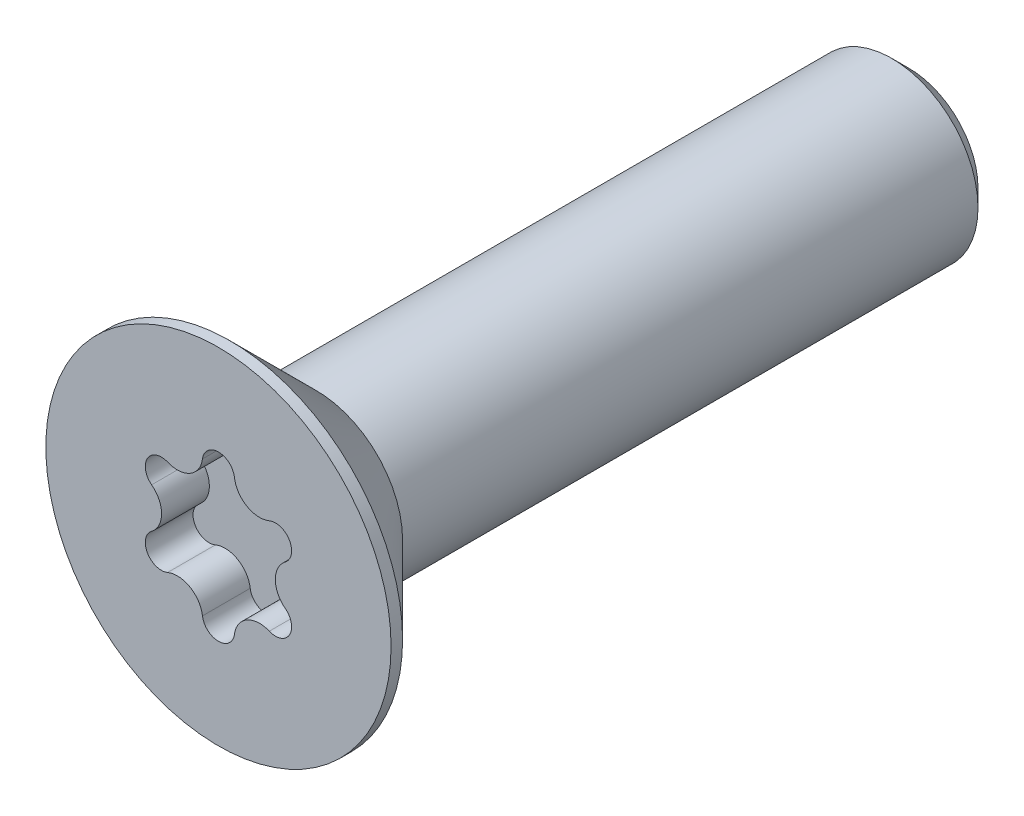
ISO-10303-21;
HEADER;
FILE_DESCRIPTION(('STEP AP214'),'2;1');
FILE_NAME('part.step','',(''),(''),'','','');
FILE_SCHEMA(('AUTOMOTIVE_DESIGN { 1 0 10303 214 1 1 1 1 }'));
ENDSEC;
DATA;
#1=APPLICATION_CONTEXT('core data for automotive mechanical design processes');
#2=APPLICATION_PROTOCOL_DEFINITION('international standard','automotive_design',2000,#1);
#3=PRODUCT_CONTEXT('',#1,'mechanical');
#4=PRODUCT('Part','Part','',(#3));
#5=PRODUCT_RELATED_PRODUCT_CATEGORY('part','',(#4));
#6=PRODUCT_DEFINITION_FORMATION('','',#4);
#7=PRODUCT_DEFINITION_CONTEXT('part definition',#1,'design');
#8=PRODUCT_DEFINITION('design','',#6,#7);
#9=PRODUCT_DEFINITION_SHAPE('','',#8);
#10=(LENGTH_UNIT() NAMED_UNIT(*) SI_UNIT(.MILLI.,.METRE.));
#11=(NAMED_UNIT(*) PLANE_ANGLE_UNIT() SI_UNIT($,.RADIAN.));
#12=(NAMED_UNIT(*) SI_UNIT($,.STERADIAN.) SOLID_ANGLE_UNIT());
#13=UNCERTAINTY_MEASURE_WITH_UNIT(LENGTH_MEASURE(1.E-05),#10,'distance_accuracy_value','');
#14=(GEOMETRIC_REPRESENTATION_CONTEXT(3) GLOBAL_UNCERTAINTY_ASSIGNED_CONTEXT((#13)) GLOBAL_UNIT_ASSIGNED_CONTEXT((#10,
#11,#12)) REPRESENTATION_CONTEXT('',''));
#15=CARTESIAN_POINT('',(0.,0.,0.));
#16=DIRECTION('',(0.,0.,1.));
#17=DIRECTION('',(1.,0.,0.));
#18=AXIS2_PLACEMENT_3D('',#15,#16,#17);
#19=CARTESIAN_POINT('',(0.,0.,-10.3));
#20=DIRECTION('',(0.,0.,1.));
#21=DIRECTION('',(1.,0.,0.));
#22=AXIS2_PLACEMENT_3D('',#19,#20,#21);
#23=PLANE('',#22);
#24=CARTESIAN_POINT('',(0.,0.,-10.3));
#25=DIRECTION('',(0.,0.,1.));
#26=DIRECTION('',(1.,0.,0.));
#27=AXIS2_PLACEMENT_3D('',#24,#25,#26);
#28=CIRCLE('',#27,1.2);
#29=CARTESIAN_POINT('',(1.2,0.,-10.3));
#30=VERTEX_POINT('',#29);
#31=EDGE_CURVE('E25',#30,#30,#28,.T.);
#32=ORIENTED_EDGE('',*,*,#31,.F.);
#33=EDGE_LOOP('',(#32));
#34=FACE_BOUND('',#33,.T.);
#35=ADVANCED_FACE('F15',(#34),#23,.F.);
#36=CARTESIAN_POINT('',(0.,0.,-10.3));
#37=DIRECTION('',(0.,0.,1.));
#38=DIRECTION('',(1.,0.,0.));
#39=AXIS2_PLACEMENT_3D('',#36,#37,#38);
#40=CONICAL_SURFACE('',#39,1.2,0.785398163397);
#41=ORIENTED_EDGE('',*,*,#31,.T.);
#42=DIRECTION('',(0.707106781186548,0.,0.707106781186548));
#43=VECTOR('',#42,1.);
#44=CARTESIAN_POINT('',(1.2,0.,-10.3));
#45=LINE('',#44,#43);
#46=CARTESIAN_POINT('',(1.5,0.,-10.));
#47=VERTEX_POINT('',#46);
#48=EDGE_CURVE('E10',#30,#47,#45,.T.);
#49=ORIENTED_EDGE('',*,*,#48,.T.);
#50=CARTESIAN_POINT('',(0.,0.,-10.));
#51=DIRECTION('',(0.,0.,1.));
#52=DIRECTION('',(1.,0.,0.));
#53=AXIS2_PLACEMENT_3D('',#50,#51,#52);
#54=CIRCLE('',#53,1.5);
#55=EDGE_CURVE('E238',#47,#47,#54,.T.);
#56=ORIENTED_EDGE('',*,*,#55,.F.);
#57=ORIENTED_EDGE('',*,*,#48,.F.);
#58=EDGE_LOOP('',(#41,#49,#56,#57));
#59=FACE_BOUND('',#58,.T.);
#60=ADVANCED_FACE('F298',(#59),#40,.T.);
#61=CARTESIAN_POINT('',(0.,0.,-10.));
#62=DIRECTION('',(0.,0.,1.));
#63=DIRECTION('',(1.,0.,0.));
#64=AXIS2_PLACEMENT_3D('',#61,#62,#63);
#65=CYLINDRICAL_SURFACE('',#64,1.5);
#66=ORIENTED_EDGE('',*,*,#55,.T.);
#67=DIRECTION('',(0.,0.,1.));
#68=VECTOR('',#67,1.);
#69=CARTESIAN_POINT('',(1.5,0.,-10.));
#70=LINE('',#69,#68);
#71=CARTESIAN_POINT('',(1.5,0.,0.));
#72=VERTEX_POINT('',#71);
#73=EDGE_CURVE('E165',#47,#72,#70,.T.);
#74=ORIENTED_EDGE('',*,*,#73,.T.);
#75=CARTESIAN_POINT('',(0.,0.,0.));
#76=DIRECTION('',(0.,0.,1.));
#77=DIRECTION('',(1.,0.,0.));
#78=AXIS2_PLACEMENT_3D('',#75,#76,#77);
#79=CIRCLE('',#78,1.5);
#80=EDGE_CURVE('E214',#72,#72,#79,.T.);
#81=ORIENTED_EDGE('',*,*,#80,.F.);
#82=ORIENTED_EDGE('',*,*,#73,.F.);
#83=EDGE_LOOP('',(#66,#74,#81,#82));
#84=FACE_BOUND('',#83,.T.);
#85=ADVANCED_FACE('F297',(#84),#65,.T.);
#86=CARTESIAN_POINT('',(0.,0.,0.87));
#87=DIRECTION('',(0.,0.,1.));
#88=DIRECTION('',(1.,0.,0.));
#89=AXIS2_PLACEMENT_3D('',#86,#87,#88);
#90=PLANE('',#89);
#91=CARTESIAN_POINT('',(0.991599087333,-0.5725,0.87));
#92=DIRECTION('',(0.,0.,-1.));
#93=DIRECTION('',(1.,0.,0.));
#94=AXIS2_PLACEMENT_3D('',#91,#92,#93);
#95=CIRCLE('',#94,0.28);
#96=CARTESIAN_POINT('',(1.161398749154,-0.349861111111,0.87));
#97=VERTEX_POINT('',#96);
#98=CARTESIAN_POINT('',(0.883687984595,-0.830870265135,0.87));
#99=VERTEX_POINT('',#98);
#100=EDGE_CURVE('E209',#97,#99,#95,.T.);
#101=ORIENTED_EDGE('',*,*,#100,.F.);
#102=CARTESIAN_POINT('',(1.428226789157,0.,0.87));
#103=DIRECTION('',(0.,0.,1.));
#104=DIRECTION('',(1.,0.,0.));
#105=AXIS2_PLACEMENT_3D('',#102,#103,#104);
#106=CIRCLE('',#105,0.44);
#107=CARTESIAN_POINT('',(1.161398749154,0.349861111111,0.87));
#108=VERTEX_POINT('',#107);
#109=EDGE_CURVE('E202',#108,#97,#106,.T.);
#110=ORIENTED_EDGE('',*,*,#109,.F.);
#111=CARTESIAN_POINT('',(0.991599087333,0.5725,0.87));
#112=DIRECTION('',(0.,0.,-1.));
#113=DIRECTION('',(1.,0.,0.));
#114=AXIS2_PLACEMENT_3D('',#111,#112,#113);
#115=CIRCLE('',#114,0.28);
#116=CARTESIAN_POINT('',(0.883687984595,0.830870265135,0.87));
#117=VERTEX_POINT('',#116);
#118=EDGE_CURVE('E166',#117,#108,#115,.T.);
#119=ORIENTED_EDGE('',*,*,#118,.F.);
#120=CARTESIAN_POINT('',(0.714113394579,1.236880681775,0.87));
#121=DIRECTION('',(0.,0.,1.));
#122=DIRECTION('',(1.,0.,0.));
#123=AXIS2_PLACEMENT_3D('',#120,#121,#122);
#124=CIRCLE('',#123,0.44);
#125=CARTESIAN_POINT('',(0.277710764558,1.180731376246,0.87));
#126=VERTEX_POINT('',#125);
#127=EDGE_CURVE('E175',#126,#117,#124,.T.);
#128=ORIENTED_EDGE('',*,*,#127,.F.);
#129=CARTESIAN_POINT('',(0.,1.145,0.87));
#130=DIRECTION('',(0.,0.,-1.));
#131=DIRECTION('',(1.,0.,0.));
#132=AXIS2_PLACEMENT_3D('',#129,#130,#131);
#133=CIRCLE('',#132,0.28);
#134=CARTESIAN_POINT('',(-0.277710764558,1.180731376246,0.87));
#135=VERTEX_POINT('',#134);
#136=EDGE_CURVE('E193',#135,#126,#133,.T.);
#137=ORIENTED_EDGE('',*,*,#136,.F.);
#138=CARTESIAN_POINT('',(-0.714113394579,1.236880681775,0.87));
#139=DIRECTION('',(0.,0.,1.));
#140=DIRECTION('',(1.,0.,0.));
#141=AXIS2_PLACEMENT_3D('',#138,#139,#140);
#142=CIRCLE('',#141,0.44);
#143=CARTESIAN_POINT('',(-0.883687984595,0.830870265135,0.87));
#144=VERTEX_POINT('',#143);
#145=EDGE_CURVE('E194',#144,#135,#142,.T.);
#146=ORIENTED_EDGE('',*,*,#145,.F.);
#147=CARTESIAN_POINT('',(-0.991599087333,0.5725,0.87));
#148=DIRECTION('',(0.,0.,-1.));
#149=DIRECTION('',(1.,0.,0.));
#150=AXIS2_PLACEMENT_3D('',#147,#148,#149);
#151=CIRCLE('',#150,0.28);
#152=CARTESIAN_POINT('',(-1.161398749154,0.349861111111,0.87));
#153=VERTEX_POINT('',#152);
#154=EDGE_CURVE('E157',#153,#144,#151,.T.);
#155=ORIENTED_EDGE('',*,*,#154,.F.);
#156=CARTESIAN_POINT('',(-1.428226789157,0.,0.87));
#157=DIRECTION('',(0.,0.,1.));
#158=DIRECTION('',(1.,0.,0.));
#159=AXIS2_PLACEMENT_3D('',#156,#157,#158);
#160=CIRCLE('',#159,0.44);
#161=CARTESIAN_POINT('',(-1.161398749154,-0.349861111111,0.87));
#162=VERTEX_POINT('',#161);
#163=EDGE_CURVE('E229',#162,#153,#160,.T.);
#164=ORIENTED_EDGE('',*,*,#163,.F.);
#165=CARTESIAN_POINT('',(-0.991599087333,-0.5725,0.87));
#166=DIRECTION('',(0.,0.,-1.));
#167=DIRECTION('',(1.,0.,0.));
#168=AXIS2_PLACEMENT_3D('',#165,#166,#167);
#169=CIRCLE('',#168,0.28);
#170=CARTESIAN_POINT('',(-0.883687984595,-0.830870265135,0.87));
#171=VERTEX_POINT('',#170);
#172=EDGE_CURVE('E151',#171,#162,#169,.T.);
#173=ORIENTED_EDGE('',*,*,#172,.F.);
#174=CARTESIAN_POINT('',(-0.714113394579,-1.236880681775,0.87));
#175=DIRECTION('',(0.,0.,1.));
#176=DIRECTION('',(1.,0.,0.));
#177=AXIS2_PLACEMENT_3D('',#174,#175,#176);
#178=CIRCLE('',#177,0.44);
#179=CARTESIAN_POINT('',(-0.277710764558,-1.180731376246,0.87));
#180=VERTEX_POINT('',#179);
#181=EDGE_CURVE('E182',#180,#171,#178,.T.);
#182=ORIENTED_EDGE('',*,*,#181,.F.);
#183=CARTESIAN_POINT('',(0.,-1.145,0.87));
#184=DIRECTION('',(0.,0.,-1.));
#185=DIRECTION('',(1.,0.,0.));
#186=AXIS2_PLACEMENT_3D('',#183,#184,#185);
#187=CIRCLE('',#186,0.28);
#188=CARTESIAN_POINT('',(0.277710764558,-1.180731376246,0.87));
#189=VERTEX_POINT('',#188);
#190=EDGE_CURVE('E219',#189,#180,#187,.T.);
#191=ORIENTED_EDGE('',*,*,#190,.F.);
#192=CARTESIAN_POINT('',(0.714113394579,-1.236880681775,0.87));
#193=DIRECTION('',(0.,0.,1.));
#194=DIRECTION('',(1.,0.,0.));
#195=AXIS2_PLACEMENT_3D('',#192,#193,#194);
#196=CIRCLE('',#195,0.44);
#197=EDGE_CURVE('E260',#99,#189,#196,.T.);
#198=ORIENTED_EDGE('',*,*,#197,.F.);
#199=EDGE_LOOP('',(#101,#110,#119,#128,#137,#146,#155,#164,#173,#182,#191,#198));
#200=FACE_BOUND('',#199,.T.);
#201=ADVANCED_FACE('F320',(#200),#90,.T.);
#202=CARTESIAN_POINT('',(0.,0.,1.5));
#203=DIRECTION('',(0.,0.,1.));
#204=DIRECTION('',(1.,0.,0.));
#205=AXIS2_PLACEMENT_3D('',#202,#203,#204);
#206=CONICAL_SURFACE('',#205,3.,0.785398163397);
#207=DIRECTION('',(-0.707106781186548,0.,-0.707106781186548));
#208=VECTOR('',#207,1.);
#209=CARTESIAN_POINT('',(3.,0.,1.5));
#210=LINE('',#209,#208);
#211=CARTESIAN_POINT('',(3.,0.,1.5));
#212=VERTEX_POINT('',#211);
#213=EDGE_CURVE('E210',#212,#72,#210,.T.);
#214=ORIENTED_EDGE('',*,*,#213,.T.);
#215=ORIENTED_EDGE('',*,*,#80,.T.);
#216=ORIENTED_EDGE('',*,*,#213,.F.);
#217=CARTESIAN_POINT('',(0.,0.,1.5));
#218=DIRECTION('',(0.,0.,1.));
#219=DIRECTION('',(1.,0.,0.));
#220=AXIS2_PLACEMENT_3D('',#217,#218,#219);
#221=CIRCLE('',#220,3.);
#222=EDGE_CURVE('E126',#212,#212,#221,.T.);
#223=ORIENTED_EDGE('',*,*,#222,.F.);
#224=EDGE_LOOP('',(#214,#215,#216,#223));
#225=FACE_BOUND('',#224,.T.);
#226=ADVANCED_FACE('F294',(#225),#206,.T.);
#227=CARTESIAN_POINT('',(0.991599087333,-0.5725,0.87));
#228=DIRECTION('',(0.,0.,-1.));
#229=DIRECTION('',(1.,0.,0.));
#230=AXIS2_PLACEMENT_3D('',#227,#228,#229);
#231=CYLINDRICAL_SURFACE('',#230,0.28);
#232=ORIENTED_EDGE('',*,*,#100,.T.);
#233=DIRECTION('',(0.,0.,1.));
#234=VECTOR('',#233,1.);
#235=CARTESIAN_POINT('',(0.883687984595,-0.830870265135,0.87));
#236=LINE('',#235,#234);
#237=CARTESIAN_POINT('',(0.883687984595,-0.830870265135,1.7));
#238=VERTEX_POINT('',#237);
#239=EDGE_CURVE('E215',#99,#238,#236,.T.);
#240=ORIENTED_EDGE('',*,*,#239,.T.);
#241=CARTESIAN_POINT('',(0.991599087333,-0.5725,1.7));
#242=DIRECTION('',(0.,0.,-1.));
#243=DIRECTION('',(1.,0.,0.));
#244=AXIS2_PLACEMENT_3D('',#241,#242,#243);
#245=CIRCLE('',#244,0.28);
#246=CARTESIAN_POINT('',(1.161398749154,-0.349861111111,1.7));
#247=VERTEX_POINT('',#246);
#248=EDGE_CURVE('E144',#247,#238,#245,.T.);
#249=ORIENTED_EDGE('',*,*,#248,.F.);
#250=DIRECTION('',(0.,0.,1.));
#251=VECTOR('',#250,1.);
#252=CARTESIAN_POINT('',(1.161398749154,-0.349861111111,0.87));
#253=LINE('',#252,#251);
#254=EDGE_CURVE('E206',#97,#247,#253,.T.);
#255=ORIENTED_EDGE('',*,*,#254,.F.);
#256=EDGE_LOOP('',(#232,#240,#249,#255));
#257=FACE_BOUND('',#256,.T.);
#258=ADVANCED_FACE('F379',(#257),#231,.F.);
#259=CARTESIAN_POINT('',(1.428226789157,0.,0.87));
#260=DIRECTION('',(0.,0.,-1.));
#261=DIRECTION('',(1.,0.,0.));
#262=AXIS2_PLACEMENT_3D('',#259,#260,#261);
#263=CYLINDRICAL_SURFACE('',#262,0.44);
#264=ORIENTED_EDGE('',*,*,#109,.T.);
#265=ORIENTED_EDGE('',*,*,#254,.T.);
#266=CARTESIAN_POINT('',(1.428226789157,0.,1.7));
#267=DIRECTION('',(0.,0.,1.));
#268=DIRECTION('',(1.,0.,0.));
#269=AXIS2_PLACEMENT_3D('',#266,#267,#268);
#270=CIRCLE('',#269,0.44);
#271=CARTESIAN_POINT('',(1.161398749154,0.349861111111,1.7));
#272=VERTEX_POINT('',#271);
#273=EDGE_CURVE('E187',#272,#247,#270,.T.);
#274=ORIENTED_EDGE('',*,*,#273,.F.);
#275=DIRECTION('',(0.,0.,1.));
#276=VECTOR('',#275,1.);
#277=CARTESIAN_POINT('',(1.161398749154,0.349861111111,0.87));
#278=LINE('',#277,#276);
#279=EDGE_CURVE('E170',#108,#272,#278,.T.);
#280=ORIENTED_EDGE('',*,*,#279,.F.);
#281=EDGE_LOOP('',(#264,#265,#274,#280));
#282=FACE_BOUND('',#281,.T.);
#283=ADVANCED_FACE('F315',(#282),#263,.T.);
#284=CARTESIAN_POINT('',(0.991599087333,0.5725,0.87));
#285=DIRECTION('',(0.,0.,-1.));
#286=DIRECTION('',(1.,0.,0.));
#287=AXIS2_PLACEMENT_3D('',#284,#285,#286);
#288=CYLINDRICAL_SURFACE('',#287,0.28);
#289=ORIENTED_EDGE('',*,*,#118,.T.);
#290=ORIENTED_EDGE('',*,*,#279,.T.);
#291=CARTESIAN_POINT('',(0.991599087333,0.5725,1.7));
#292=DIRECTION('',(0.,0.,-1.));
#293=DIRECTION('',(1.,0.,0.));
#294=AXIS2_PLACEMENT_3D('',#291,#292,#293);
#295=CIRCLE('',#294,0.28);
#296=CARTESIAN_POINT('',(0.883687984595,0.830870265135,1.7));
#297=VERTEX_POINT('',#296);
#298=EDGE_CURVE('E149',#297,#272,#295,.T.);
#299=ORIENTED_EDGE('',*,*,#298,.F.);
#300=DIRECTION('',(0.,0.,1.));
#301=VECTOR('',#300,1.);
#302=CARTESIAN_POINT('',(0.883687984595,0.830870265135,0.87));
#303=LINE('',#302,#301);
#304=EDGE_CURVE('E171',#117,#297,#303,.T.);
#305=ORIENTED_EDGE('',*,*,#304,.F.);
#306=EDGE_LOOP('',(#289,#290,#299,#305));
#307=FACE_BOUND('',#306,.T.);
#308=ADVANCED_FACE('F312',(#307),#288,.F.);
#309=CARTESIAN_POINT('',(0.714113394579,1.236880681775,0.87));
#310=DIRECTION('',(0.,0.,-1.));
#311=DIRECTION('',(1.,0.,0.));
#312=AXIS2_PLACEMENT_3D('',#309,#310,#311);
#313=CYLINDRICAL_SURFACE('',#312,0.44);
#314=ORIENTED_EDGE('',*,*,#127,.T.);
#315=ORIENTED_EDGE('',*,*,#304,.T.);
#316=CARTESIAN_POINT('',(0.714113394579,1.236880681775,1.7));
#317=DIRECTION('',(0.,0.,1.));
#318=DIRECTION('',(1.,0.,0.));
#319=AXIS2_PLACEMENT_3D('',#316,#317,#318);
#320=CIRCLE('',#319,0.44);
#321=CARTESIAN_POINT('',(0.277710764558,1.180731376246,1.7));
#322=VERTEX_POINT('',#321);
#323=EDGE_CURVE('E146',#322,#297,#320,.T.);
#324=ORIENTED_EDGE('',*,*,#323,.F.);
#325=DIRECTION('',(0.,0.,1.));
#326=VECTOR('',#325,1.);
#327=CARTESIAN_POINT('',(0.277710764558,1.180731376246,0.87));
#328=LINE('',#327,#326);
#329=EDGE_CURVE('E237',#126,#322,#328,.T.);
#330=ORIENTED_EDGE('',*,*,#329,.F.);
#331=EDGE_LOOP('',(#314,#315,#324,#330));
#332=FACE_BOUND('',#331,.T.);
#333=ADVANCED_FACE('F314',(#332),#313,.T.);
#334=CARTESIAN_POINT('',(0.,1.145,0.87));
#335=DIRECTION('',(0.,0.,-1.));
#336=DIRECTION('',(1.,0.,0.));
#337=AXIS2_PLACEMENT_3D('',#334,#335,#336);
#338=CYLINDRICAL_SURFACE('',#337,0.28);
#339=ORIENTED_EDGE('',*,*,#136,.T.);
#340=ORIENTED_EDGE('',*,*,#329,.T.);
#341=CARTESIAN_POINT('',(0.,1.145,1.7));
#342=DIRECTION('',(0.,0.,-1.));
#343=DIRECTION('',(1.,0.,0.));
#344=AXIS2_PLACEMENT_3D('',#341,#342,#343);
#345=CIRCLE('',#344,0.28);
#346=CARTESIAN_POINT('',(-0.277710764558,1.180731376246,1.7));
#347=VERTEX_POINT('',#346);
#348=EDGE_CURVE('E150',#347,#322,#345,.T.);
#349=ORIENTED_EDGE('',*,*,#348,.F.);
#350=DIRECTION('',(0.,0.,1.));
#351=VECTOR('',#350,1.);
#352=CARTESIAN_POINT('',(-0.277710764558,1.180731376246,0.87));
#353=LINE('',#352,#351);
#354=EDGE_CURVE('E191',#135,#347,#353,.T.);
#355=ORIENTED_EDGE('',*,*,#354,.F.);
#356=EDGE_LOOP('',(#339,#340,#349,#355));
#357=FACE_BOUND('',#356,.T.);
#358=ADVANCED_FACE('F323',(#357),#338,.F.);
#359=CARTESIAN_POINT('',(-0.714113394579,1.236880681775,0.87));
#360=DIRECTION('',(0.,0.,-1.));
#361=DIRECTION('',(1.,0.,0.));
#362=AXIS2_PLACEMENT_3D('',#359,#360,#361);
#363=CYLINDRICAL_SURFACE('',#362,0.44);
#364=ORIENTED_EDGE('',*,*,#145,.T.);
#365=ORIENTED_EDGE('',*,*,#354,.T.);
#366=CARTESIAN_POINT('',(-0.714113394579,1.236880681775,1.7));
#367=DIRECTION('',(0.,0.,1.));
#368=DIRECTION('',(1.,0.,0.));
#369=AXIS2_PLACEMENT_3D('',#366,#367,#368);
#370=CIRCLE('',#369,0.44);
#371=CARTESIAN_POINT('',(-0.883687984595,0.830870265135,1.7));
#372=VERTEX_POINT('',#371);
#373=EDGE_CURVE('E224',#372,#347,#370,.T.);
#374=ORIENTED_EDGE('',*,*,#373,.F.);
#375=DIRECTION('',(0.,0.,1.));
#376=VECTOR('',#375,1.);
#377=CARTESIAN_POINT('',(-0.883687984595,0.830870265135,0.87));
#378=LINE('',#377,#376);
#379=EDGE_CURVE('E161',#144,#372,#378,.T.);
#380=ORIENTED_EDGE('',*,*,#379,.F.);
#381=EDGE_LOOP('',(#364,#365,#374,#380));
#382=FACE_BOUND('',#381,.T.);
#383=ADVANCED_FACE('F310',(#382),#363,.T.);
#384=CARTESIAN_POINT('',(-0.991599087333,0.5725,0.87));
#385=DIRECTION('',(0.,0.,-1.));
#386=DIRECTION('',(1.,0.,0.));
#387=AXIS2_PLACEMENT_3D('',#384,#385,#386);
#388=CYLINDRICAL_SURFACE('',#387,0.28);
#389=ORIENTED_EDGE('',*,*,#154,.T.);
#390=ORIENTED_EDGE('',*,*,#379,.T.);
#391=CARTESIAN_POINT('',(-0.991599087333,0.5725,1.7));
#392=DIRECTION('',(0.,0.,-1.));
#393=DIRECTION('',(1.,0.,0.));
#394=AXIS2_PLACEMENT_3D('',#391,#392,#393);
#395=CIRCLE('',#394,0.28);
#396=CARTESIAN_POINT('',(-1.161398749154,0.349861111111,1.7));
#397=VERTEX_POINT('',#396);
#398=EDGE_CURVE('E180',#397,#372,#395,.T.);
#399=ORIENTED_EDGE('',*,*,#398,.F.);
#400=DIRECTION('',(0.,0.,1.));
#401=VECTOR('',#400,1.);
#402=CARTESIAN_POINT('',(-1.161398749154,0.349861111111,0.87));
#403=LINE('',#402,#401);
#404=EDGE_CURVE('E162',#153,#397,#403,.T.);
#405=ORIENTED_EDGE('',*,*,#404,.F.);
#406=EDGE_LOOP('',(#389,#390,#399,#405));
#407=FACE_BOUND('',#406,.T.);
#408=ADVANCED_FACE('F333',(#407),#388,.F.);
#409=CARTESIAN_POINT('',(-1.428226789157,0.,0.87));
#410=DIRECTION('',(0.,0.,-1.));
#411=DIRECTION('',(1.,0.,0.));
#412=AXIS2_PLACEMENT_3D('',#409,#410,#411);
#413=CYLINDRICAL_SURFACE('',#412,0.44);
#414=ORIENTED_EDGE('',*,*,#163,.T.);
#415=ORIENTED_EDGE('',*,*,#404,.T.);
#416=CARTESIAN_POINT('',(-1.428226789157,0.,1.7));
#417=DIRECTION('',(0.,0.,1.));
#418=DIRECTION('',(1.,0.,0.));
#419=AXIS2_PLACEMENT_3D('',#416,#417,#418);
#420=CIRCLE('',#419,0.44);
#421=CARTESIAN_POINT('',(-1.161398749154,-0.349861111111,1.7));
#422=VERTEX_POINT('',#421);
#423=EDGE_CURVE('E176',#422,#397,#420,.T.);
#424=ORIENTED_EDGE('',*,*,#423,.F.);
#425=DIRECTION('',(0.,0.,1.));
#426=VECTOR('',#425,1.);
#427=CARTESIAN_POINT('',(-1.161398749154,-0.349861111111,0.87));
#428=LINE('',#427,#426);
#429=EDGE_CURVE('E155',#162,#422,#428,.T.);
#430=ORIENTED_EDGE('',*,*,#429,.F.);
#431=EDGE_LOOP('',(#414,#415,#424,#430));
#432=FACE_BOUND('',#431,.T.);
#433=ADVANCED_FACE('F329',(#432),#413,.T.);
#434=CARTESIAN_POINT('',(-0.991599087333,-0.5725,0.87));
#435=DIRECTION('',(0.,0.,-1.));
#436=DIRECTION('',(1.,0.,0.));
#437=AXIS2_PLACEMENT_3D('',#434,#435,#436);
#438=CYLINDRICAL_SURFACE('',#437,0.28);
#439=ORIENTED_EDGE('',*,*,#172,.T.);
#440=ORIENTED_EDGE('',*,*,#429,.T.);
#441=CARTESIAN_POINT('',(-0.991599087333,-0.5725,1.7));
#442=DIRECTION('',(0.,0.,-1.));
#443=DIRECTION('',(1.,0.,0.));
#444=AXIS2_PLACEMENT_3D('',#441,#442,#443);
#445=CIRCLE('',#444,0.28);
#446=CARTESIAN_POINT('',(-0.883687984595,-0.830870265135,1.7));
#447=VERTEX_POINT('',#446);
#448=EDGE_CURVE('E181',#447,#422,#445,.T.);
#449=ORIENTED_EDGE('',*,*,#448,.F.);
#450=DIRECTION('',(0.,0.,1.));
#451=VECTOR('',#450,1.);
#452=CARTESIAN_POINT('',(-0.883687984595,-0.830870265135,0.87));
#453=LINE('',#452,#451);
#454=EDGE_CURVE('E156',#171,#447,#453,.T.);
#455=ORIENTED_EDGE('',*,*,#454,.F.);
#456=EDGE_LOOP('',(#439,#440,#449,#455));
#457=FACE_BOUND('',#456,.T.);
#458=ADVANCED_FACE('F325',(#457),#438,.F.);
#459=CARTESIAN_POINT('',(-0.714113394579,-1.236880681775,0.87));
#460=DIRECTION('',(0.,0.,-1.));
#461=DIRECTION('',(1.,0.,0.));
#462=AXIS2_PLACEMENT_3D('',#459,#460,#461);
#463=CYLINDRICAL_SURFACE('',#462,0.44);
#464=ORIENTED_EDGE('',*,*,#181,.T.);
#465=ORIENTED_EDGE('',*,*,#454,.T.);
#466=CARTESIAN_POINT('',(-0.714113394579,-1.236880681775,1.7));
#467=DIRECTION('',(0.,0.,1.));
#468=DIRECTION('',(1.,0.,0.));
#469=AXIS2_PLACEMENT_3D('',#466,#467,#468);
#470=CIRCLE('',#469,0.44);
#471=CARTESIAN_POINT('',(-0.277710764558,-1.180731376246,1.7));
#472=VERTEX_POINT('',#471);
#473=EDGE_CURVE('E140',#472,#447,#470,.T.);
#474=ORIENTED_EDGE('',*,*,#473,.F.);
#475=DIRECTION('',(0.,0.,1.));
#476=VECTOR('',#475,1.);
#477=CARTESIAN_POINT('',(-0.277710764558,-1.180731376246,0.87));
#478=LINE('',#477,#476);
#479=EDGE_CURVE('E186',#180,#472,#478,.T.);
#480=ORIENTED_EDGE('',*,*,#479,.F.);
#481=EDGE_LOOP('',(#464,#465,#474,#480));
#482=FACE_BOUND('',#481,.T.);
#483=ADVANCED_FACE('F328',(#482),#463,.T.);
#484=CARTESIAN_POINT('',(0.,-1.145,0.87));
#485=DIRECTION('',(0.,0.,-1.));
#486=DIRECTION('',(1.,0.,0.));
#487=AXIS2_PLACEMENT_3D('',#484,#485,#486);
#488=CYLINDRICAL_SURFACE('',#487,0.28);
#489=ORIENTED_EDGE('',*,*,#190,.T.);
#490=ORIENTED_EDGE('',*,*,#479,.T.);
#491=CARTESIAN_POINT('',(0.,-1.145,1.7));
#492=DIRECTION('',(0.,0.,-1.));
#493=DIRECTION('',(1.,0.,0.));
#494=AXIS2_PLACEMENT_3D('',#491,#492,#493);
#495=CIRCLE('',#494,0.28);
#496=CARTESIAN_POINT('',(0.277710764558,-1.180731376246,1.7));
#497=VERTEX_POINT('',#496);
#498=EDGE_CURVE('E133',#497,#472,#495,.T.);
#499=ORIENTED_EDGE('',*,*,#498,.F.);
#500=DIRECTION('',(0.,0.,1.));
#501=VECTOR('',#500,1.);
#502=CARTESIAN_POINT('',(0.277710764558,-1.180731376246,0.87));
#503=LINE('',#502,#501);
#504=EDGE_CURVE('E220',#189,#497,#503,.T.);
#505=ORIENTED_EDGE('',*,*,#504,.F.);
#506=EDGE_LOOP('',(#489,#490,#499,#505));
#507=FACE_BOUND('',#506,.T.);
#508=ADVANCED_FACE('F399',(#507),#488,.F.);
#509=CARTESIAN_POINT('',(0.714113394579,-1.236880681775,0.87));
#510=DIRECTION('',(0.,0.,-1.));
#511=DIRECTION('',(1.,0.,0.));
#512=AXIS2_PLACEMENT_3D('',#509,#510,#511);
#513=CYLINDRICAL_SURFACE('',#512,0.44);
#514=ORIENTED_EDGE('',*,*,#197,.T.);
#515=ORIENTED_EDGE('',*,*,#504,.T.);
#516=CARTESIAN_POINT('',(0.714113394579,-1.236880681775,1.7));
#517=DIRECTION('',(0.,0.,1.));
#518=DIRECTION('',(1.,0.,0.));
#519=AXIS2_PLACEMENT_3D('',#516,#517,#518);
#520=CIRCLE('',#519,0.44);
#521=EDGE_CURVE('E128',#238,#497,#520,.T.);
#522=ORIENTED_EDGE('',*,*,#521,.F.);
#523=ORIENTED_EDGE('',*,*,#239,.F.);
#524=EDGE_LOOP('',(#514,#515,#522,#523));
#525=FACE_BOUND('',#524,.T.);
#526=ADVANCED_FACE('F384',(#525),#513,.T.);
#527=CARTESIAN_POINT('',(0.,0.,1.7));
#528=DIRECTION('',(0.,0.,-1.));
#529=DIRECTION('',(1.,0.,0.));
#530=AXIS2_PLACEMENT_3D('',#527,#528,#529);
#531=CYLINDRICAL_SURFACE('',#530,3.);
#532=DIRECTION('',(0.,0.,-1.));
#533=VECTOR('',#532,1.);
#534=CARTESIAN_POINT('',(3.,0.,1.7));
#535=LINE('',#534,#533);
#536=CARTESIAN_POINT('',(3.,0.,1.7));
#537=VERTEX_POINT('',#536);
#538=EDGE_CURVE('E122',#537,#212,#535,.T.);
#539=ORIENTED_EDGE('',*,*,#538,.T.);
#540=ORIENTED_EDGE('',*,*,#222,.T.);
#541=ORIENTED_EDGE('',*,*,#538,.F.);
#542=CARTESIAN_POINT('',(0.,0.,1.7));
#543=DIRECTION('',(0.,0.,1.));
#544=DIRECTION('',(1.,0.,0.));
#545=AXIS2_PLACEMENT_3D('',#542,#543,#544);
#546=CIRCLE('',#545,3.);
#547=EDGE_CURVE('E124',#537,#537,#546,.T.);
#548=ORIENTED_EDGE('',*,*,#547,.F.);
#549=EDGE_LOOP('',(#539,#540,#541,#548));
#550=FACE_BOUND('',#549,.T.);
#551=ADVANCED_FACE('F17',(#550),#531,.T.);
#552=CARTESIAN_POINT('',(0.,0.,1.7));
#553=DIRECTION('',(0.,0.,1.));
#554=DIRECTION('',(1.,0.,0.));
#555=AXIS2_PLACEMENT_3D('',#552,#553,#554);
#556=PLANE('',#555);
#557=ORIENTED_EDGE('',*,*,#498,.T.);
#558=ORIENTED_EDGE('',*,*,#473,.T.);
#559=ORIENTED_EDGE('',*,*,#448,.T.);
#560=ORIENTED_EDGE('',*,*,#423,.T.);
#561=ORIENTED_EDGE('',*,*,#398,.T.);
#562=ORIENTED_EDGE('',*,*,#373,.T.);
#563=ORIENTED_EDGE('',*,*,#348,.T.);
#564=ORIENTED_EDGE('',*,*,#323,.T.);
#565=ORIENTED_EDGE('',*,*,#298,.T.);
#566=ORIENTED_EDGE('',*,*,#273,.T.);
#567=ORIENTED_EDGE('',*,*,#248,.T.);
#568=ORIENTED_EDGE('',*,*,#521,.T.);
#569=EDGE_LOOP('',(#557,#558,#559,#560,#561,#562,#563,#564,#565,#566,#567,#568));
#570=FACE_BOUND('',#569,.T.);
#571=ORIENTED_EDGE('',*,*,#547,.T.);
#572=EDGE_LOOP('',(#571));
#573=FACE_BOUND('',#572,.T.);
#574=ADVANCED_FACE('F131',(#570,#573),#556,.T.);
#575=CLOSED_SHELL('',(#35,#60,#85,#201,#226,#258,#283,#308,#333,#358,#383,#408,#433,#458,#483,
#508,#526,#551,#574));
#576=MANIFOLD_SOLID_BREP('B1',#575);
#577=ADVANCED_BREP_SHAPE_REPRESENTATION('',(#18,#576),#14);
#578=SHAPE_DEFINITION_REPRESENTATION(#9,#577);
ENDSEC;
END-ISO-10303-21;
